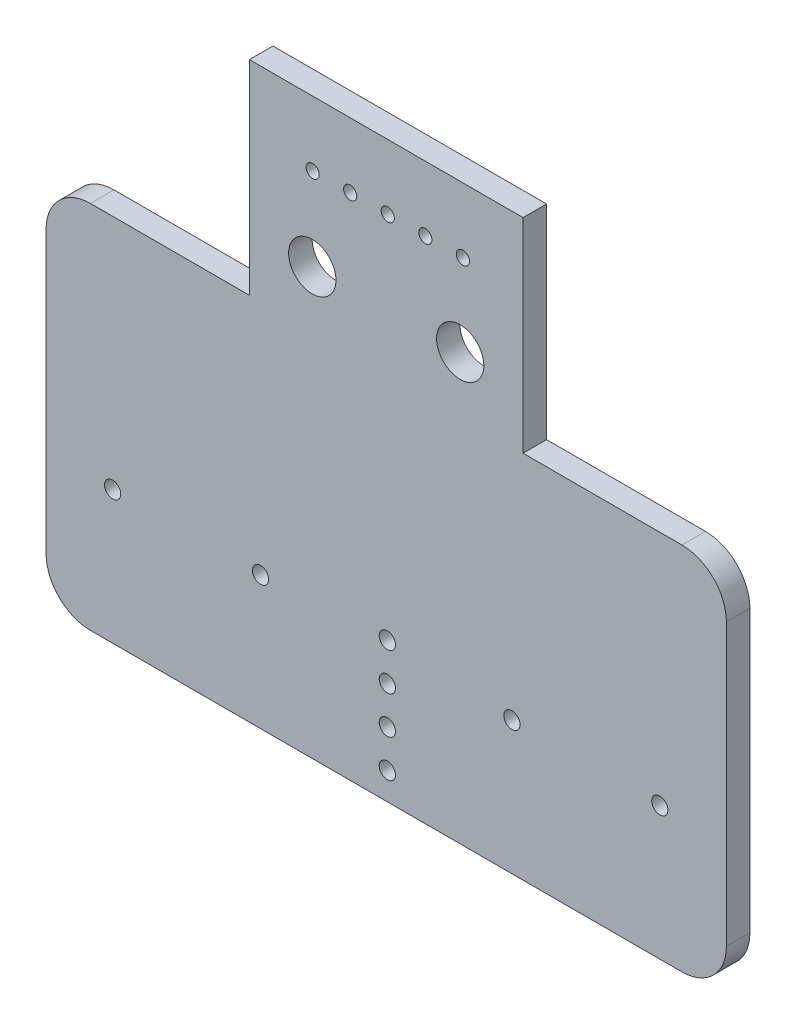
ISO-10303-21;
HEADER;
FILE_DESCRIPTION(('STEP AP214'),'2;1');
FILE_NAME('part.step','',(''),(''),'','','');
FILE_SCHEMA(('AUTOMOTIVE_DESIGN { 1 0 10303 214 1 1 1 1 }'));
ENDSEC;
DATA;
#1=APPLICATION_CONTEXT('core data for automotive mechanical design processes');
#2=APPLICATION_PROTOCOL_DEFINITION('international standard','automotive_design',2000,#1);
#3=PRODUCT_CONTEXT('',#1,'mechanical');
#4=PRODUCT('Part','Part','',(#3));
#5=PRODUCT_RELATED_PRODUCT_CATEGORY('part','',(#4));
#6=PRODUCT_DEFINITION_FORMATION('','',#4);
#7=PRODUCT_DEFINITION_CONTEXT('part definition',#1,'design');
#8=PRODUCT_DEFINITION('design','',#6,#7);
#9=PRODUCT_DEFINITION_SHAPE('','',#8);
#10=(LENGTH_UNIT() NAMED_UNIT(*) SI_UNIT(.MILLI.,.METRE.));
#11=(NAMED_UNIT(*) PLANE_ANGLE_UNIT() SI_UNIT($,.RADIAN.));
#12=(NAMED_UNIT(*) SI_UNIT($,.STERADIAN.) SOLID_ANGLE_UNIT());
#13=UNCERTAINTY_MEASURE_WITH_UNIT(LENGTH_MEASURE(1.E-05),#10,'distance_accuracy_value','');
#14=(GEOMETRIC_REPRESENTATION_CONTEXT(3) GLOBAL_UNCERTAINTY_ASSIGNED_CONTEXT((#13)) GLOBAL_UNIT_ASSIGNED_CONTEXT((#10,
#11,#12)) REPRESENTATION_CONTEXT('',''));
#15=CARTESIAN_POINT('',(0.,0.,0.));
#16=DIRECTION('',(0.,0.,1.));
#17=DIRECTION('',(1.,0.,0.));
#18=AXIS2_PLACEMENT_3D('',#15,#16,#17);
#19=CARTESIAN_POINT('',(88.90599822998,72.36499786377,1.59143954));
#20=DIRECTION('',(0.,0.,1.));
#21=DIRECTION('',(1.,0.,0.));
#22=AXIS2_PLACEMENT_3D('',#19,#20,#21);
#23=PLANE('',#22);
#24=CARTESIAN_POINT('',(117.0899995,103.78000072,1.59143954));
#25=DIRECTION('',(0.,0.,1.));
#26=DIRECTION('',(1.,0.,0.));
#27=AXIS2_PLACEMENT_3D('',#24,#25,#26);
#28=CIRCLE('',#27,0.4445);
#29=CARTESIAN_POINT('',(117.5344995,103.78000072,1.59143954));
#30=VERTEX_POINT('',#29);
#31=EDGE_CURVE('E27',#30,#30,#28,.T.);
#32=ORIENTED_EDGE('',*,*,#31,.F.);
#33=EDGE_LOOP('',(#32));
#34=FACE_BOUND('',#33,.T.);
#35=CARTESIAN_POINT('',(116.90599936,98.16500052,1.59143954));
#36=DIRECTION('',(0.,0.,1.));
#37=DIRECTION('',(1.,0.,0.));
#38=AXIS2_PLACEMENT_3D('',#35,#36,#37);
#39=CIRCLE('',#38,1.59999934);
#40=CARTESIAN_POINT('',(118.5059987,98.16500052,1.59143954));
#41=VERTEX_POINT('',#40);
#42=EDGE_CURVE('E310',#41,#41,#39,.T.);
#43=ORIENTED_EDGE('',*,*,#42,.F.);
#44=EDGE_LOOP('',(#43));
#45=FACE_BOUND('',#44,.T.);
#46=CARTESIAN_POINT('',(112.0099995,103.78000072,1.59143954));
#47=DIRECTION('',(0.,0.,1.));
#48=DIRECTION('',(1.,0.,0.));
#49=AXIS2_PLACEMENT_3D('',#46,#47,#48);
#50=CIRCLE('',#49,0.4445);
#51=CARTESIAN_POINT('',(112.4544995,103.78000072,1.59143954));
#52=VERTEX_POINT('',#51);
#53=EDGE_CURVE('E383',#52,#52,#50,.T.);
#54=ORIENTED_EDGE('',*,*,#53,.F.);
#55=EDGE_LOOP('',(#54));
#56=FACE_BOUND('',#55,.T.);
#57=CARTESIAN_POINT('',(114.5499995,103.78000072,1.59143954));
#58=DIRECTION('',(0.,0.,1.));
#59=DIRECTION('',(1.,0.,0.));
#60=AXIS2_PLACEMENT_3D('',#57,#58,#59);
#61=CIRCLE('',#60,0.4445);
#62=CARTESIAN_POINT('',(114.9944995,103.78000072,1.59143954));
#63=VERTEX_POINT('',#62);
#64=EDGE_CURVE('E333',#63,#63,#61,.T.);
#65=ORIENTED_EDGE('',*,*,#64,.F.);
#66=EDGE_LOOP('',(#65));
#67=FACE_BOUND('',#66,.T.);
#68=CARTESIAN_POINT('',(120.40599998,78.36499948,1.59143954));
#69=DIRECTION('',(0.,0.,1.));
#70=DIRECTION('',(1.,0.,0.));
#71=AXIS2_PLACEMENT_3D('',#68,#69,#70);
#72=CIRCLE('',#71,0.5499989);
#73=CARTESIAN_POINT('',(120.95599888,78.36499948,1.59143954));
#74=VERTEX_POINT('',#73);
#75=EDGE_CURVE('E277',#74,#74,#72,.T.);
#76=ORIENTED_EDGE('',*,*,#75,.F.);
#77=EDGE_LOOP('',(#76));
#78=FACE_BOUND('',#77,.T.);
#79=CARTESIAN_POINT('',(130.4060003,78.36499948,1.59143954));
#80=DIRECTION('',(0.,0.,1.));
#81=DIRECTION('',(1.,0.,0.));
#82=AXIS2_PLACEMENT_3D('',#79,#80,#81);
#83=CIRCLE('',#82,0.5499989);
#84=CARTESIAN_POINT('',(130.9559992,78.36499948,1.59143954));
#85=VERTEX_POINT('',#84);
#86=EDGE_CURVE('E287',#85,#85,#83,.T.);
#87=ORIENTED_EDGE('',*,*,#86,.F.);
#88=EDGE_LOOP('',(#87));
#89=FACE_BOUND('',#88,.T.);
#90=CARTESIAN_POINT('',(111.97999956,78.82999982,1.59143954));
#91=DIRECTION('',(0.,0.,1.));
#92=DIRECTION('',(1.,0.,0.));
#93=AXIS2_PLACEMENT_3D('',#90,#91,#92);
#94=CIRCLE('',#93,0.5499989);
#95=CARTESIAN_POINT('',(112.52999846,78.82999982,1.59143954));
#96=VERTEX_POINT('',#95);
#97=EDGE_CURVE('E507',#96,#96,#94,.T.);
#98=ORIENTED_EDGE('',*,*,#97,.F.);
#99=EDGE_LOOP('',(#98));
#100=FACE_BOUND('',#99,.T.);
#101=CARTESIAN_POINT('',(111.97999956,73.74999982,1.59143954));
#102=DIRECTION('',(0.,0.,1.));
#103=DIRECTION('',(1.,0.,0.));
#104=AXIS2_PLACEMENT_3D('',#101,#102,#103);
#105=CIRCLE('',#104,0.5499989);
#106=CARTESIAN_POINT('',(112.52999846,73.74999982,1.59143954));
#107=VERTEX_POINT('',#106);
#108=EDGE_CURVE('E454',#107,#107,#105,.T.);
#109=ORIENTED_EDGE('',*,*,#108,.F.);
#110=EDGE_LOOP('',(#109));
#111=FACE_BOUND('',#110,.T.);
#112=CARTESIAN_POINT('',(109.4699995,103.78000072,1.59143954));
#113=DIRECTION('',(0.,0.,1.));
#114=DIRECTION('',(1.,0.,0.));
#115=AXIS2_PLACEMENT_3D('',#112,#113,#114);
#116=CIRCLE('',#115,0.4445);
#117=CARTESIAN_POINT('',(109.9144995,103.78000072,1.59143954));
#118=VERTEX_POINT('',#117);
#119=EDGE_CURVE('E436',#118,#118,#116,.T.);
#120=ORIENTED_EDGE('',*,*,#119,.F.);
#121=EDGE_LOOP('',(#120));
#122=FACE_BOUND('',#121,.T.);
#123=CARTESIAN_POINT('',(106.90599904,98.16500052,1.59143954));
#124=DIRECTION('',(0.,0.,1.));
#125=DIRECTION('',(1.,0.,0.));
#126=AXIS2_PLACEMENT_3D('',#123,#124,#125);
#127=CIRCLE('',#126,1.59999934);
#128=CARTESIAN_POINT('',(108.50599838,98.16500052,1.59143954));
#129=VERTEX_POINT('',#128);
#130=EDGE_CURVE('E432',#129,#129,#127,.T.);
#131=ORIENTED_EDGE('',*,*,#130,.F.);
#132=EDGE_LOOP('',(#131));
#133=FACE_BOUND('',#132,.T.);
#134=CARTESIAN_POINT('',(106.9299995,103.78000072,1.59143954));
#135=DIRECTION('',(0.,0.,1.));
#136=DIRECTION('',(1.,0.,0.));
#137=AXIS2_PLACEMENT_3D('',#134,#135,#136);
#138=CIRCLE('',#137,0.4445);
#139=CARTESIAN_POINT('',(107.3744995,103.78000072,1.59143954));
#140=VERTEX_POINT('',#139);
#141=EDGE_CURVE('E282',#140,#140,#138,.T.);
#142=ORIENTED_EDGE('',*,*,#141,.F.);
#143=EDGE_LOOP('',(#142));
#144=FACE_BOUND('',#143,.T.);
#145=CARTESIAN_POINT('',(93.40600064,78.36499948,1.59143954));
#146=DIRECTION('',(0.,0.,1.));
#147=DIRECTION('',(1.,0.,0.));
#148=AXIS2_PLACEMENT_3D('',#145,#146,#147);
#149=CIRCLE('',#148,0.5499989);
#150=CARTESIAN_POINT('',(93.95599954,78.36499948,1.59143954));
#151=VERTEX_POINT('',#150);
#152=EDGE_CURVE('E222',#151,#151,#149,.T.);
#153=ORIENTED_EDGE('',*,*,#152,.F.);
#154=EDGE_LOOP('',(#153));
#155=FACE_BOUND('',#154,.T.);
#156=CARTESIAN_POINT('',(111.97999956,76.28999982,1.59143954));
#157=DIRECTION('',(0.,0.,1.));
#158=DIRECTION('',(1.,0.,0.));
#159=AXIS2_PLACEMENT_3D('',#156,#157,#158);
#160=CIRCLE('',#159,0.5499989);
#161=CARTESIAN_POINT('',(112.52999846,76.28999982,1.59143954));
#162=VERTEX_POINT('',#161);
#163=EDGE_CURVE('E407',#162,#162,#160,.T.);
#164=ORIENTED_EDGE('',*,*,#163,.F.);
#165=EDGE_LOOP('',(#164));
#166=FACE_BOUND('',#165,.T.);
#167=CARTESIAN_POINT('',(111.97999956,71.20999982,1.59143954));
#168=DIRECTION('',(0.,0.,1.));
#169=DIRECTION('',(1.,0.,0.));
#170=AXIS2_PLACEMENT_3D('',#167,#168,#169);
#171=CIRCLE('',#170,0.5499989);
#172=CARTESIAN_POINT('',(112.52999846,71.20999982,1.59143954));
#173=VERTEX_POINT('',#172);
#174=EDGE_CURVE('E272',#173,#173,#171,.T.);
#175=ORIENTED_EDGE('',*,*,#174,.F.);
#176=EDGE_LOOP('',(#175));
#177=FACE_BOUND('',#176,.T.);
#178=CARTESIAN_POINT('',(103.40600096,78.36499948,1.59143954));
#179=DIRECTION('',(0.,0.,1.));
#180=DIRECTION('',(1.,0.,0.));
#181=AXIS2_PLACEMENT_3D('',#178,#179,#180);
#182=CIRCLE('',#181,0.5499989);
#183=CARTESIAN_POINT('',(103.95599986,78.36499948,1.59143954));
#184=VERTEX_POINT('',#183);
#185=EDGE_CURVE('E374',#184,#184,#182,.T.);
#186=ORIENTED_EDGE('',*,*,#185,.F.);
#187=EDGE_LOOP('',(#186));
#188=FACE_BOUND('',#187,.T.);
#189=CARTESIAN_POINT('',(91.907110995802,72.366110629591,1.59143954));
#190=DIRECTION('',(0.,0.,-1.));
#191=DIRECTION('',(-0.000370784383045174,-0.999999931259468,0.));
#192=AXIS2_PLACEMENT_3D('',#189,#190,#191);
#193=CIRCLE('',#192,3.00111297212);
#194=CARTESIAN_POINT('',(91.90599822998,69.36499786377,1.59143954));
#195=VERTEX_POINT('',#194);
#196=CARTESIAN_POINT('',(88.90599822998,72.36499786377,1.59143954));
#197=VERTEX_POINT('',#196);
#198=EDGE_CURVE('E235',#195,#197,#193,.T.);
#199=ORIENTED_EDGE('',*,*,#198,.F.);
#200=DIRECTION('',(-1.,0.,0.));
#201=VECTOR('',#200,1.);
#202=CARTESIAN_POINT('',(131.90600585937,69.36499786377,1.59143954));
#203=LINE('',#202,#201);
#204=CARTESIAN_POINT('',(131.90600585937,69.36499786377,1.59143954));
#205=VERTEX_POINT('',#204);
#206=EDGE_CURVE('E238',#205,#195,#203,.T.);
#207=ORIENTED_EDGE('',*,*,#206,.F.);
#208=CARTESIAN_POINT('',(131.90488005763,72.366123665506,1.59143954));
#209=DIRECTION('',(0.,0.,-1.));
#210=DIRECTION('',(0.999999929640072,-0.000375126446434927,0.));
#211=AXIS2_PLACEMENT_3D('',#208,#209,#210);
#212=CIRCLE('',#211,3.001126012896);
#213=CARTESIAN_POINT('',(134.90600585937,72.36499786377,1.59143954));
#214=VERTEX_POINT('',#213);
#215=EDGE_CURVE('E295',#214,#205,#212,.T.);
#216=ORIENTED_EDGE('',*,*,#215,.F.);
#217=DIRECTION('',(0.,-1.,0.));
#218=VECTOR('',#217,1.);
#219=CARTESIAN_POINT('',(134.90600585937,91.36499786377,1.59143954));
#220=LINE('',#219,#218);
#221=CARTESIAN_POINT('',(134.90600585937,91.36499786377,1.59143954));
#222=VERTEX_POINT('',#221);
#223=EDGE_CURVE('E368',#222,#214,#220,.T.);
#224=ORIENTED_EDGE('',*,*,#223,.F.);
#225=CARTESIAN_POINT('',(131.90659982584,91.36559183024,1.59143954));
#226=DIRECTION('',(0.,0.,-1.));
#227=DIRECTION('',(-0.000198028026988589,0.99999998039245,0.));
#228=AXIS2_PLACEMENT_3D('',#225,#226,#227);
#229=CIRCLE('',#228,2.99940609234);
#230=CARTESIAN_POINT('',(131.90600585937,94.36499786377,1.59143954));
#231=VERTEX_POINT('',#230);
#232=EDGE_CURVE('E424',#231,#222,#229,.T.);
#233=ORIENTED_EDGE('',*,*,#232,.F.);
#234=DIRECTION('',(1.,0.,0.));
#235=VECTOR('',#234,1.);
#236=CARTESIAN_POINT('',(121.15599822998,94.36499786377,1.59143954));
#237=LINE('',#236,#235);
#238=CARTESIAN_POINT('',(121.15599822998,94.36499786377,1.59143954));
#239=VERTEX_POINT('',#238);
#240=EDGE_CURVE('E480',#239,#231,#237,.T.);
#241=ORIENTED_EDGE('',*,*,#240,.F.);
#242=DIRECTION('',(0.,-1.,0.));
#243=VECTOR('',#242,1.);
#244=CARTESIAN_POINT('',(121.15599822998,108.16500091552,1.59143954));
#245=LINE('',#244,#243);
#246=CARTESIAN_POINT('',(121.15599822998,108.16500091552,1.59143954));
#247=VERTEX_POINT('',#246);
#248=EDGE_CURVE('E361',#247,#239,#245,.T.);
#249=ORIENTED_EDGE('',*,*,#248,.F.);
#250=DIRECTION('',(1.,0.,0.));
#251=VECTOR('',#250,1.);
#252=CARTESIAN_POINT('',(102.65599822998,108.16500091552,1.59143954));
#253=LINE('',#252,#251);
#254=CARTESIAN_POINT('',(102.65599822998,108.16500091552,1.59143954));
#255=VERTEX_POINT('',#254);
#256=EDGE_CURVE('E298',#255,#247,#253,.T.);
#257=ORIENTED_EDGE('',*,*,#256,.F.);
#258=DIRECTION('',(0.,1.,0.));
#259=VECTOR('',#258,1.);
#260=CARTESIAN_POINT('',(102.65599822998,94.36499786377,1.59143954));
#261=LINE('',#260,#259);
#262=CARTESIAN_POINT('',(102.65599822998,94.36499786377,1.59143954));
#263=VERTEX_POINT('',#262);
#264=EDGE_CURVE('E345',#263,#255,#261,.T.);
#265=ORIENTED_EDGE('',*,*,#264,.F.);
#266=DIRECTION('',(1.,0.,0.));
#267=VECTOR('',#266,1.);
#268=CARTESIAN_POINT('',(91.90599822998,94.36499786377,1.59143954));
#269=LINE('',#268,#267);
#270=CARTESIAN_POINT('',(91.90599822998,94.36499786377,1.59143954));
#271=VERTEX_POINT('',#270);
#272=EDGE_CURVE('E394',#271,#263,#269,.T.);
#273=ORIENTED_EDGE('',*,*,#272,.F.);
#274=CARTESIAN_POINT('',(91.907097960001,91.363898133749,1.59143954));
#275=DIRECTION('',(0.,0.,-1.));
#276=DIRECTION('',(-0.999999932860011,0.000366442319648004,0.));
#277=AXIS2_PLACEMENT_3D('',#274,#275,#276);
#278=CIRCLE('',#277,3.001099931514);
#279=CARTESIAN_POINT('',(88.90599822998,91.36499786377,1.59143954));
#280=VERTEX_POINT('',#279);
#281=EDGE_CURVE('E367',#280,#271,#278,.T.);
#282=ORIENTED_EDGE('',*,*,#281,.F.);
#283=DIRECTION('',(0.,1.,0.));
#284=VECTOR('',#283,1.);
#285=CARTESIAN_POINT('',(88.90599822998,72.36499786377,1.59143954));
#286=LINE('',#285,#284);
#287=EDGE_CURVE('E241',#197,#280,#286,.T.);
#288=ORIENTED_EDGE('',*,*,#287,.F.);
#289=EDGE_LOOP('',(#199,#207,#216,#224,#233,#241,#249,#257,#265,#273,#282,#288));
#290=FACE_BOUND('',#289,.T.);
#291=ADVANCED_FACE('F16',(#34,#45,#56,#67,#78,#89,#100,#111,#122,#133,#144,#155,#166,#177,#188,
#290),#23,.T.);
#292=CARTESIAN_POINT('',(88.90599822998,72.36499786377,0.));
#293=DIRECTION('',(0.,0.,1.));
#294=DIRECTION('',(1.,0.,0.));
#295=AXIS2_PLACEMENT_3D('',#292,#293,#294);
#296=PLANE('',#295);
#297=CARTESIAN_POINT('',(117.0899995,103.78000072,0.));
#298=DIRECTION('',(0.,0.,1.));
#299=DIRECTION('',(1.,0.,0.));
#300=AXIS2_PLACEMENT_3D('',#297,#298,#299);
#301=CIRCLE('',#300,0.4445);
#302=CARTESIAN_POINT('',(117.5344995,103.78000072,0.));
#303=VERTEX_POINT('',#302);
#304=EDGE_CURVE('E11',#303,#303,#301,.T.);
#305=ORIENTED_EDGE('',*,*,#304,.T.);
#306=EDGE_LOOP('',(#305));
#307=FACE_BOUND('',#306,.T.);
#308=CARTESIAN_POINT('',(116.90599936,98.16500052,0.));
#309=DIRECTION('',(0.,0.,1.));
#310=DIRECTION('',(1.,0.,0.));
#311=AXIS2_PLACEMENT_3D('',#308,#309,#310);
#312=CIRCLE('',#311,1.59999934);
#313=CARTESIAN_POINT('',(118.5059987,98.16500052,0.));
#314=VERTEX_POINT('',#313);
#315=EDGE_CURVE('E306',#314,#314,#312,.T.);
#316=ORIENTED_EDGE('',*,*,#315,.T.);
#317=EDGE_LOOP('',(#316));
#318=FACE_BOUND('',#317,.T.);
#319=CARTESIAN_POINT('',(112.0099995,103.78000072,0.));
#320=DIRECTION('',(0.,0.,1.));
#321=DIRECTION('',(1.,0.,0.));
#322=AXIS2_PLACEMENT_3D('',#319,#320,#321);
#323=CIRCLE('',#322,0.4445);
#324=CARTESIAN_POINT('',(112.4544995,103.78000072,0.));
#325=VERTEX_POINT('',#324);
#326=EDGE_CURVE('E327',#325,#325,#323,.T.);
#327=ORIENTED_EDGE('',*,*,#326,.T.);
#328=EDGE_LOOP('',(#327));
#329=FACE_BOUND('',#328,.T.);
#330=CARTESIAN_POINT('',(114.5499995,103.78000072,0.));
#331=DIRECTION('',(0.,0.,1.));
#332=DIRECTION('',(1.,0.,0.));
#333=AXIS2_PLACEMENT_3D('',#330,#331,#332);
#334=CIRCLE('',#333,0.4445);
#335=CARTESIAN_POINT('',(114.9944995,103.78000072,0.));
#336=VERTEX_POINT('',#335);
#337=EDGE_CURVE('E337',#336,#336,#334,.T.);
#338=ORIENTED_EDGE('',*,*,#337,.T.);
#339=EDGE_LOOP('',(#338));
#340=FACE_BOUND('',#339,.T.);
#341=CARTESIAN_POINT('',(120.40599998,78.36499948,0.));
#342=DIRECTION('',(0.,0.,1.));
#343=DIRECTION('',(1.,0.,0.));
#344=AXIS2_PLACEMENT_3D('',#341,#342,#343);
#345=CIRCLE('',#344,0.5499989);
#346=CARTESIAN_POINT('',(120.95599888,78.36499948,0.));
#347=VERTEX_POINT('',#346);
#348=EDGE_CURVE('E280',#347,#347,#345,.T.);
#349=ORIENTED_EDGE('',*,*,#348,.T.);
#350=EDGE_LOOP('',(#349));
#351=FACE_BOUND('',#350,.T.);
#352=CARTESIAN_POINT('',(130.4060003,78.36499948,0.));
#353=DIRECTION('',(0.,0.,1.));
#354=DIRECTION('',(1.,0.,0.));
#355=AXIS2_PLACEMENT_3D('',#352,#353,#354);
#356=CIRCLE('',#355,0.5499989);
#357=CARTESIAN_POINT('',(130.9559992,78.36499948,0.));
#358=VERTEX_POINT('',#357);
#359=EDGE_CURVE('E289',#358,#358,#356,.T.);
#360=ORIENTED_EDGE('',*,*,#359,.T.);
#361=EDGE_LOOP('',(#360));
#362=FACE_BOUND('',#361,.T.);
#363=CARTESIAN_POINT('',(111.97999956,78.82999982,0.));
#364=DIRECTION('',(0.,0.,1.));
#365=DIRECTION('',(1.,0.,0.));
#366=AXIS2_PLACEMENT_3D('',#363,#364,#365);
#367=CIRCLE('',#366,0.5499989);
#368=CARTESIAN_POINT('',(112.52999846,78.82999982,0.));
#369=VERTEX_POINT('',#368);
#370=EDGE_CURVE('E398',#369,#369,#367,.T.);
#371=ORIENTED_EDGE('',*,*,#370,.T.);
#372=EDGE_LOOP('',(#371));
#373=FACE_BOUND('',#372,.T.);
#374=CARTESIAN_POINT('',(111.97999956,73.74999982,0.));
#375=DIRECTION('',(0.,0.,1.));
#376=DIRECTION('',(1.,0.,0.));
#377=AXIS2_PLACEMENT_3D('',#374,#375,#376);
#378=CIRCLE('',#377,0.5499989);
#379=CARTESIAN_POINT('',(112.52999846,73.74999982,0.));
#380=VERTEX_POINT('',#379);
#381=EDGE_CURVE('E466',#380,#380,#378,.T.);
#382=ORIENTED_EDGE('',*,*,#381,.T.);
#383=EDGE_LOOP('',(#382));
#384=FACE_BOUND('',#383,.T.);
#385=CARTESIAN_POINT('',(109.4699995,103.78000072,0.));
#386=DIRECTION('',(0.,0.,1.));
#387=DIRECTION('',(1.,0.,0.));
#388=AXIS2_PLACEMENT_3D('',#385,#386,#387);
#389=CIRCLE('',#388,0.4445);
#390=CARTESIAN_POINT('',(109.9144995,103.78000072,0.));
#391=VERTEX_POINT('',#390);
#392=EDGE_CURVE('E439',#391,#391,#389,.T.);
#393=ORIENTED_EDGE('',*,*,#392,.T.);
#394=EDGE_LOOP('',(#393));
#395=FACE_BOUND('',#394,.T.);
#396=CARTESIAN_POINT('',(106.90599904,98.16500052,0.));
#397=DIRECTION('',(0.,0.,1.));
#398=DIRECTION('',(1.,0.,0.));
#399=AXIS2_PLACEMENT_3D('',#396,#397,#398);
#400=CIRCLE('',#399,1.59999934);
#401=CARTESIAN_POINT('',(108.50599838,98.16500052,0.));
#402=VERTEX_POINT('',#401);
#403=EDGE_CURVE('E435',#402,#402,#400,.T.);
#404=ORIENTED_EDGE('',*,*,#403,.T.);
#405=EDGE_LOOP('',(#404));
#406=FACE_BOUND('',#405,.T.);
#407=CARTESIAN_POINT('',(106.9299995,103.78000072,0.));
#408=DIRECTION('',(0.,0.,1.));
#409=DIRECTION('',(1.,0.,0.));
#410=AXIS2_PLACEMENT_3D('',#407,#408,#409);
#411=CIRCLE('',#410,0.4445);
#412=CARTESIAN_POINT('',(107.3744995,103.78000072,0.));
#413=VERTEX_POINT('',#412);
#414=EDGE_CURVE('E284',#413,#413,#411,.T.);
#415=ORIENTED_EDGE('',*,*,#414,.T.);
#416=EDGE_LOOP('',(#415));
#417=FACE_BOUND('',#416,.T.);
#418=CARTESIAN_POINT('',(93.40600064,78.36499948,0.));
#419=DIRECTION('',(0.,0.,1.));
#420=DIRECTION('',(1.,0.,0.));
#421=AXIS2_PLACEMENT_3D('',#418,#419,#420);
#422=CIRCLE('',#421,0.5499989);
#423=CARTESIAN_POINT('',(93.95599954,78.36499948,0.));
#424=VERTEX_POINT('',#423);
#425=EDGE_CURVE('E211',#424,#424,#422,.T.);
#426=ORIENTED_EDGE('',*,*,#425,.T.);
#427=EDGE_LOOP('',(#426));
#428=FACE_BOUND('',#427,.T.);
#429=CARTESIAN_POINT('',(111.97999956,76.28999982,0.));
#430=DIRECTION('',(0.,0.,1.));
#431=DIRECTION('',(1.,0.,0.));
#432=AXIS2_PLACEMENT_3D('',#429,#430,#431);
#433=CIRCLE('',#432,0.5499989);
#434=CARTESIAN_POINT('',(112.52999846,76.28999982,0.));
#435=VERTEX_POINT('',#434);
#436=EDGE_CURVE('E404',#435,#435,#433,.T.);
#437=ORIENTED_EDGE('',*,*,#436,.T.);
#438=EDGE_LOOP('',(#437));
#439=FACE_BOUND('',#438,.T.);
#440=CARTESIAN_POINT('',(111.97999956,71.20999982,0.));
#441=DIRECTION('',(0.,0.,1.));
#442=DIRECTION('',(1.,0.,0.));
#443=AXIS2_PLACEMENT_3D('',#440,#441,#442);
#444=CIRCLE('',#443,0.5499989);
#445=CARTESIAN_POINT('',(112.52999846,71.20999982,0.));
#446=VERTEX_POINT('',#445);
#447=EDGE_CURVE('E275',#446,#446,#444,.T.);
#448=ORIENTED_EDGE('',*,*,#447,.T.);
#449=EDGE_LOOP('',(#448));
#450=FACE_BOUND('',#449,.T.);
#451=CARTESIAN_POINT('',(103.40600096,78.36499948,0.));
#452=DIRECTION('',(0.,0.,1.));
#453=DIRECTION('',(1.,0.,0.));
#454=AXIS2_PLACEMENT_3D('',#451,#452,#453);
#455=CIRCLE('',#454,0.5499989);
#456=CARTESIAN_POINT('',(103.95599986,78.36499948,0.));
#457=VERTEX_POINT('',#456);
#458=EDGE_CURVE('E377',#457,#457,#455,.T.);
#459=ORIENTED_EDGE('',*,*,#458,.T.);
#460=EDGE_LOOP('',(#459));
#461=FACE_BOUND('',#460,.T.);
#462=DIRECTION('',(0.,1.,0.));
#463=VECTOR('',#462,1.);
#464=CARTESIAN_POINT('',(88.90599822998,72.36499786377,0.));
#465=LINE('',#464,#463);
#466=CARTESIAN_POINT('',(88.90599822998,72.36499786377,0.));
#467=VERTEX_POINT('',#466);
#468=CARTESIAN_POINT('',(88.90599822998,91.36499786377,0.));
#469=VERTEX_POINT('',#468);
#470=EDGE_CURVE('E390',#467,#469,#465,.T.);
#471=ORIENTED_EDGE('',*,*,#470,.T.);
#472=CARTESIAN_POINT('',(91.907097960001,91.363898133749,0.));
#473=DIRECTION('',(0.,0.,-1.));
#474=DIRECTION('',(-0.999999932860011,0.000366442319648004,0.));
#475=AXIS2_PLACEMENT_3D('',#472,#473,#474);
#476=CIRCLE('',#475,3.001099931514);
#477=CARTESIAN_POINT('',(91.90599822998,94.36499786377,0.));
#478=VERTEX_POINT('',#477);
#479=EDGE_CURVE('E366',#469,#478,#476,.T.);
#480=ORIENTED_EDGE('',*,*,#479,.T.);
#481=DIRECTION('',(1.,0.,0.));
#482=VECTOR('',#481,1.);
#483=CARTESIAN_POINT('',(91.90599822998,94.36499786377,0.));
#484=LINE('',#483,#482);
#485=CARTESIAN_POINT('',(102.65599822998,94.36499786377,0.));
#486=VERTEX_POINT('',#485);
#487=EDGE_CURVE('E341',#478,#486,#484,.T.);
#488=ORIENTED_EDGE('',*,*,#487,.T.);
#489=DIRECTION('',(0.,1.,0.));
#490=VECTOR('',#489,1.);
#491=CARTESIAN_POINT('',(102.65599822998,94.36499786377,0.));
#492=LINE('',#491,#490);
#493=CARTESIAN_POINT('',(102.65599822998,108.16500091552,0.));
#494=VERTEX_POINT('',#493);
#495=EDGE_CURVE('E303',#486,#494,#492,.T.);
#496=ORIENTED_EDGE('',*,*,#495,.T.);
#497=DIRECTION('',(1.,0.,0.));
#498=VECTOR('',#497,1.);
#499=CARTESIAN_POINT('',(102.65599822998,108.16500091552,0.));
#500=LINE('',#499,#498);
#501=CARTESIAN_POINT('',(121.15599822998,108.16500091552,0.));
#502=VERTEX_POINT('',#501);
#503=EDGE_CURVE('E357',#494,#502,#500,.T.);
#504=ORIENTED_EDGE('',*,*,#503,.T.);
#505=DIRECTION('',(0.,-1.,0.));
#506=VECTOR('',#505,1.);
#507=CARTESIAN_POINT('',(121.15599822998,108.16500091552,0.));
#508=LINE('',#507,#506);
#509=CARTESIAN_POINT('',(121.15599822998,94.36499786377,0.));
#510=VERTEX_POINT('',#509);
#511=EDGE_CURVE('E481',#502,#510,#508,.T.);
#512=ORIENTED_EDGE('',*,*,#511,.T.);
#513=DIRECTION('',(1.,0.,0.));
#514=VECTOR('',#513,1.);
#515=CARTESIAN_POINT('',(121.15599822998,94.36499786377,0.));
#516=LINE('',#515,#514);
#517=CARTESIAN_POINT('',(131.90600585937,94.36499786377,0.));
#518=VERTEX_POINT('',#517);
#519=EDGE_CURVE('E420',#510,#518,#516,.T.);
#520=ORIENTED_EDGE('',*,*,#519,.T.);
#521=CARTESIAN_POINT('',(131.90659982584,91.36559183024,0.));
#522=DIRECTION('',(0.,0.,-1.));
#523=DIRECTION('',(-0.000198028026988589,0.99999998039245,0.));
#524=AXIS2_PLACEMENT_3D('',#521,#522,#523);
#525=CIRCLE('',#524,2.99940609234);
#526=CARTESIAN_POINT('',(134.90600585937,91.36499786377,0.));
#527=VERTEX_POINT('',#526);
#528=EDGE_CURVE('E373',#518,#527,#525,.T.);
#529=ORIENTED_EDGE('',*,*,#528,.T.);
#530=DIRECTION('',(0.,-1.,0.));
#531=VECTOR('',#530,1.);
#532=CARTESIAN_POINT('',(134.90600585937,91.36499786377,0.));
#533=LINE('',#532,#531);
#534=CARTESIAN_POINT('',(134.90600585937,72.36499786377,0.));
#535=VERTEX_POINT('',#534);
#536=EDGE_CURVE('E20',#527,#535,#533,.T.);
#537=ORIENTED_EDGE('',*,*,#536,.T.);
#538=CARTESIAN_POINT('',(131.90488005763,72.366123665506,0.));
#539=DIRECTION('',(0.,0.,-1.));
#540=DIRECTION('',(0.999999929640072,-0.000375126446434927,0.));
#541=AXIS2_PLACEMENT_3D('',#538,#539,#540);
#542=CIRCLE('',#541,3.001126012896);
#543=CARTESIAN_POINT('',(131.90600585937,69.36499786377,0.));
#544=VERTEX_POINT('',#543);
#545=EDGE_CURVE('E261',#535,#544,#542,.T.);
#546=ORIENTED_EDGE('',*,*,#545,.T.);
#547=DIRECTION('',(-1.,0.,0.));
#548=VECTOR('',#547,1.);
#549=CARTESIAN_POINT('',(131.90600585937,69.36499786377,0.));
#550=LINE('',#549,#548);
#551=CARTESIAN_POINT('',(91.90599822998,69.36499786377,0.));
#552=VERTEX_POINT('',#551);
#553=EDGE_CURVE('E247',#544,#552,#550,.T.);
#554=ORIENTED_EDGE('',*,*,#553,.T.);
#555=CARTESIAN_POINT('',(91.907110995802,72.366110629591,0.));
#556=DIRECTION('',(0.,0.,-1.));
#557=DIRECTION('',(-0.000370784383045174,-0.999999931259468,0.));
#558=AXIS2_PLACEMENT_3D('',#555,#556,#557);
#559=CIRCLE('',#558,3.00111297212);
#560=EDGE_CURVE('E246',#552,#467,#559,.T.);
#561=ORIENTED_EDGE('',*,*,#560,.T.);
#562=EDGE_LOOP('',(#471,#480,#488,#496,#504,#512,#520,#529,#537,#546,#554,#561));
#563=FACE_BOUND('',#562,.T.);
#564=ADVANCED_FACE('F571',(#307,#318,#329,#340,#351,#362,#373,#384,#395,#406,#417,#428,#439,
#450,#461,#563),#296,.F.);
#565=CARTESIAN_POINT('',(117.0899995,103.78000072,0.));
#566=DIRECTION('',(0.,0.,-1.));
#567=DIRECTION('',(1.,0.,0.));
#568=AXIS2_PLACEMENT_3D('',#565,#566,#567);
#569=CYLINDRICAL_SURFACE('',#568,0.4445);
#570=DIRECTION('',(0.,0.,1.));
#571=VECTOR('',#570,1.);
#572=CARTESIAN_POINT('',(117.5344995,103.78000072,0.));
#573=LINE('',#572,#571);
#574=EDGE_CURVE('E309',#303,#30,#573,.T.);
#575=ORIENTED_EDGE('',*,*,#574,.T.);
#576=ORIENTED_EDGE('',*,*,#31,.T.);
#577=ORIENTED_EDGE('',*,*,#574,.F.);
#578=ORIENTED_EDGE('',*,*,#304,.F.);
#579=EDGE_LOOP('',(#575,#576,#577,#578));
#580=FACE_BOUND('',#579,.T.);
#581=ADVANCED_FACE('F577',(#580),#569,.F.);
#582=CARTESIAN_POINT('',(116.90599936,98.16500052,0.));
#583=DIRECTION('',(0.,0.,-1.));
#584=DIRECTION('',(1.,0.,0.));
#585=AXIS2_PLACEMENT_3D('',#582,#583,#584);
#586=CYLINDRICAL_SURFACE('',#585,1.59999934);
#587=DIRECTION('',(0.,0.,1.));
#588=VECTOR('',#587,1.);
#589=CARTESIAN_POINT('',(118.5059987,98.16500052,0.));
#590=LINE('',#589,#588);
#591=EDGE_CURVE('E318',#314,#41,#590,.T.);
#592=ORIENTED_EDGE('',*,*,#591,.T.);
#593=ORIENTED_EDGE('',*,*,#42,.T.);
#594=ORIENTED_EDGE('',*,*,#591,.F.);
#595=ORIENTED_EDGE('',*,*,#315,.F.);
#596=EDGE_LOOP('',(#592,#593,#594,#595));
#597=FACE_BOUND('',#596,.T.);
#598=ADVANCED_FACE('F592',(#597),#586,.F.);
#599=CARTESIAN_POINT('',(112.0099995,103.78000072,0.));
#600=DIRECTION('',(0.,0.,-1.));
#601=DIRECTION('',(1.,0.,0.));
#602=AXIS2_PLACEMENT_3D('',#599,#600,#601);
#603=CYLINDRICAL_SURFACE('',#602,0.4445);
#604=DIRECTION('',(0.,0.,1.));
#605=VECTOR('',#604,1.);
#606=CARTESIAN_POINT('',(112.4544995,103.78000072,0.));
#607=LINE('',#606,#605);
#608=EDGE_CURVE('E379',#325,#52,#607,.T.);
#609=ORIENTED_EDGE('',*,*,#608,.T.);
#610=ORIENTED_EDGE('',*,*,#53,.T.);
#611=ORIENTED_EDGE('',*,*,#608,.F.);
#612=ORIENTED_EDGE('',*,*,#326,.F.);
#613=EDGE_LOOP('',(#609,#610,#611,#612));
#614=FACE_BOUND('',#613,.T.);
#615=ADVANCED_FACE('F589',(#614),#603,.F.);
#616=CARTESIAN_POINT('',(114.5499995,103.78000072,0.));
#617=DIRECTION('',(0.,0.,-1.));
#618=DIRECTION('',(1.,0.,0.));
#619=AXIS2_PLACEMENT_3D('',#616,#617,#618);
#620=CYLINDRICAL_SURFACE('',#619,0.4445);
#621=DIRECTION('',(0.,0.,1.));
#622=VECTOR('',#621,1.);
#623=CARTESIAN_POINT('',(114.9944995,103.78000072,0.));
#624=LINE('',#623,#622);
#625=EDGE_CURVE('E305',#336,#63,#624,.T.);
#626=ORIENTED_EDGE('',*,*,#625,.T.);
#627=ORIENTED_EDGE('',*,*,#64,.T.);
#628=ORIENTED_EDGE('',*,*,#625,.F.);
#629=ORIENTED_EDGE('',*,*,#337,.F.);
#630=EDGE_LOOP('',(#626,#627,#628,#629));
#631=FACE_BOUND('',#630,.T.);
#632=ADVANCED_FACE('F591',(#631),#620,.F.);
#633=CARTESIAN_POINT('',(120.40599998,78.36499948,0.));
#634=DIRECTION('',(0.,0.,-1.));
#635=DIRECTION('',(1.,0.,0.));
#636=AXIS2_PLACEMENT_3D('',#633,#634,#635);
#637=CYLINDRICAL_SURFACE('',#636,0.5499989);
#638=DIRECTION('',(0.,0.,1.));
#639=VECTOR('',#638,1.);
#640=CARTESIAN_POINT('',(120.95599888,78.36499948,0.));
#641=LINE('',#640,#639);
#642=EDGE_CURVE('E281',#347,#74,#641,.T.);
#643=ORIENTED_EDGE('',*,*,#642,.T.);
#644=ORIENTED_EDGE('',*,*,#75,.T.);
#645=ORIENTED_EDGE('',*,*,#642,.F.);
#646=ORIENTED_EDGE('',*,*,#348,.F.);
#647=EDGE_LOOP('',(#643,#644,#645,#646));
#648=FACE_BOUND('',#647,.T.);
#649=ADVANCED_FACE('F598',(#648),#637,.F.);
#650=CARTESIAN_POINT('',(130.4060003,78.36499948,0.));
#651=DIRECTION('',(0.,0.,-1.));
#652=DIRECTION('',(1.,0.,0.));
#653=AXIS2_PLACEMENT_3D('',#650,#651,#652);
#654=CYLINDRICAL_SURFACE('',#653,0.5499989);
#655=DIRECTION('',(0.,0.,1.));
#656=VECTOR('',#655,1.);
#657=CARTESIAN_POINT('',(130.9559992,78.36499948,0.));
#658=LINE('',#657,#656);
#659=EDGE_CURVE('E290',#358,#85,#658,.T.);
#660=ORIENTED_EDGE('',*,*,#659,.T.);
#661=ORIENTED_EDGE('',*,*,#86,.T.);
#662=ORIENTED_EDGE('',*,*,#659,.F.);
#663=ORIENTED_EDGE('',*,*,#359,.F.);
#664=EDGE_LOOP('',(#660,#661,#662,#663));
#665=FACE_BOUND('',#664,.T.);
#666=ADVANCED_FACE('F1131',(#665),#654,.F.);
#667=CARTESIAN_POINT('',(111.97999956,78.82999982,0.));
#668=DIRECTION('',(0.,0.,-1.));
#669=DIRECTION('',(1.,0.,0.));
#670=AXIS2_PLACEMENT_3D('',#667,#668,#669);
#671=CYLINDRICAL_SURFACE('',#670,0.5499989);
#672=DIRECTION('',(0.,0.,1.));
#673=VECTOR('',#672,1.);
#674=CARTESIAN_POINT('',(112.52999846,78.82999982,0.));
#675=LINE('',#674,#673);
#676=EDGE_CURVE('E469',#369,#96,#675,.T.);
#677=ORIENTED_EDGE('',*,*,#676,.T.);
#678=ORIENTED_EDGE('',*,*,#97,.T.);
#679=ORIENTED_EDGE('',*,*,#676,.F.);
#680=ORIENTED_EDGE('',*,*,#370,.F.);
#681=EDGE_LOOP('',(#677,#678,#679,#680));
#682=FACE_BOUND('',#681,.T.);
#683=ADVANCED_FACE('F1121',(#682),#671,.F.);
#684=CARTESIAN_POINT('',(111.97999956,73.74999982,0.));
#685=DIRECTION('',(0.,0.,-1.));
#686=DIRECTION('',(1.,0.,0.));
#687=AXIS2_PLACEMENT_3D('',#684,#685,#686);
#688=CYLINDRICAL_SURFACE('',#687,0.5499989);
#689=DIRECTION('',(0.,0.,1.));
#690=VECTOR('',#689,1.);
#691=CARTESIAN_POINT('',(112.52999846,73.74999982,0.));
#692=LINE('',#691,#690);
#693=EDGE_CURVE('E451',#380,#107,#692,.T.);
#694=ORIENTED_EDGE('',*,*,#693,.T.);
#695=ORIENTED_EDGE('',*,*,#108,.T.);
#696=ORIENTED_EDGE('',*,*,#693,.F.);
#697=ORIENTED_EDGE('',*,*,#381,.F.);
#698=EDGE_LOOP('',(#694,#695,#696,#697));
#699=FACE_BOUND('',#698,.T.);
#700=ADVANCED_FACE('F1111',(#699),#688,.F.);
#701=CARTESIAN_POINT('',(109.4699995,103.78000072,0.));
#702=DIRECTION('',(0.,0.,-1.));
#703=DIRECTION('',(1.,0.,0.));
#704=AXIS2_PLACEMENT_3D('',#701,#702,#703);
#705=CYLINDRICAL_SURFACE('',#704,0.4445);
#706=DIRECTION('',(0.,0.,1.));
#707=VECTOR('',#706,1.);
#708=CARTESIAN_POINT('',(109.9144995,103.78000072,0.));
#709=LINE('',#708,#707);
#710=EDGE_CURVE('E440',#391,#118,#709,.T.);
#711=ORIENTED_EDGE('',*,*,#710,.T.);
#712=ORIENTED_EDGE('',*,*,#119,.T.);
#713=ORIENTED_EDGE('',*,*,#710,.F.);
#714=ORIENTED_EDGE('',*,*,#392,.F.);
#715=EDGE_LOOP('',(#711,#712,#713,#714));
#716=FACE_BOUND('',#715,.T.);
#717=ADVANCED_FACE('F1100',(#716),#705,.F.);
#718=CARTESIAN_POINT('',(106.90599904,98.16500052,0.));
#719=DIRECTION('',(0.,0.,-1.));
#720=DIRECTION('',(1.,0.,0.));
#721=AXIS2_PLACEMENT_3D('',#718,#719,#720);
#722=CYLINDRICAL_SURFACE('',#721,1.59999934);
#723=DIRECTION('',(0.,0.,1.));
#724=VECTOR('',#723,1.);
#725=CARTESIAN_POINT('',(108.50599838,98.16500052,0.));
#726=LINE('',#725,#724);
#727=EDGE_CURVE('E294',#402,#129,#726,.T.);
#728=ORIENTED_EDGE('',*,*,#727,.T.);
#729=ORIENTED_EDGE('',*,*,#130,.T.);
#730=ORIENTED_EDGE('',*,*,#727,.F.);
#731=ORIENTED_EDGE('',*,*,#403,.F.);
#732=EDGE_LOOP('',(#728,#729,#730,#731));
#733=FACE_BOUND('',#732,.T.);
#734=ADVANCED_FACE('F566',(#733),#722,.F.);
#735=CARTESIAN_POINT('',(106.9299995,103.78000072,0.));
#736=DIRECTION('',(0.,0.,-1.));
#737=DIRECTION('',(1.,0.,0.));
#738=AXIS2_PLACEMENT_3D('',#735,#736,#737);
#739=CYLINDRICAL_SURFACE('',#738,0.4445);
#740=DIRECTION('',(0.,0.,1.));
#741=VECTOR('',#740,1.);
#742=CARTESIAN_POINT('',(107.3744995,103.78000072,0.));
#743=LINE('',#742,#741);
#744=EDGE_CURVE('E285',#413,#140,#743,.T.);
#745=ORIENTED_EDGE('',*,*,#744,.T.);
#746=ORIENTED_EDGE('',*,*,#141,.T.);
#747=ORIENTED_EDGE('',*,*,#744,.F.);
#748=ORIENTED_EDGE('',*,*,#414,.F.);
#749=EDGE_LOOP('',(#745,#746,#747,#748));
#750=FACE_BOUND('',#749,.T.);
#751=ADVANCED_FACE('F557',(#750),#739,.F.);
#752=CARTESIAN_POINT('',(93.40600064,78.36499948,0.));
#753=DIRECTION('',(0.,0.,-1.));
#754=DIRECTION('',(1.,0.,0.));
#755=AXIS2_PLACEMENT_3D('',#752,#753,#754);
#756=CYLINDRICAL_SURFACE('',#755,0.5499989);
#757=DIRECTION('',(0.,0.,1.));
#758=VECTOR('',#757,1.);
#759=CARTESIAN_POINT('',(93.95599954,78.36499948,0.));
#760=LINE('',#759,#758);
#761=EDGE_CURVE('E353',#424,#151,#760,.T.);
#762=ORIENTED_EDGE('',*,*,#761,.T.);
#763=ORIENTED_EDGE('',*,*,#152,.T.);
#764=ORIENTED_EDGE('',*,*,#761,.F.);
#765=ORIENTED_EDGE('',*,*,#425,.F.);
#766=EDGE_LOOP('',(#762,#763,#764,#765));
#767=FACE_BOUND('',#766,.T.);
#768=ADVANCED_FACE('F554',(#767),#756,.F.);
#769=CARTESIAN_POINT('',(111.97999956,76.28999982,0.));
#770=DIRECTION('',(0.,0.,-1.));
#771=DIRECTION('',(1.,0.,0.));
#772=AXIS2_PLACEMENT_3D('',#769,#770,#771);
#773=CYLINDRICAL_SURFACE('',#772,0.5499989);
#774=DIRECTION('',(0.,0.,1.));
#775=VECTOR('',#774,1.);
#776=CARTESIAN_POINT('',(112.52999846,76.28999982,0.));
#777=LINE('',#776,#775);
#778=EDGE_CURVE('E414',#435,#162,#777,.T.);
#779=ORIENTED_EDGE('',*,*,#778,.T.);
#780=ORIENTED_EDGE('',*,*,#163,.T.);
#781=ORIENTED_EDGE('',*,*,#778,.F.);
#782=ORIENTED_EDGE('',*,*,#436,.F.);
#783=EDGE_LOOP('',(#779,#780,#781,#782));
#784=FACE_BOUND('',#783,.T.);
#785=ADVANCED_FACE('F556',(#784),#773,.F.);
#786=CARTESIAN_POINT('',(111.97999956,71.20999982,0.));
#787=DIRECTION('',(0.,0.,-1.));
#788=DIRECTION('',(1.,0.,0.));
#789=AXIS2_PLACEMENT_3D('',#786,#787,#788);
#790=CYLINDRICAL_SURFACE('',#789,0.5499989);
#791=DIRECTION('',(0.,0.,1.));
#792=VECTOR('',#791,1.);
#793=CARTESIAN_POINT('',(112.52999846,71.20999982,0.));
#794=LINE('',#793,#792);
#795=EDGE_CURVE('E276',#446,#173,#794,.T.);
#796=ORIENTED_EDGE('',*,*,#795,.T.);
#797=ORIENTED_EDGE('',*,*,#174,.T.);
#798=ORIENTED_EDGE('',*,*,#795,.F.);
#799=ORIENTED_EDGE('',*,*,#447,.F.);
#800=EDGE_LOOP('',(#796,#797,#798,#799));
#801=FACE_BOUND('',#800,.T.);
#802=ADVANCED_FACE('F564',(#801),#790,.F.);
#803=CARTESIAN_POINT('',(103.40600096,78.36499948,0.));
#804=DIRECTION('',(0.,0.,-1.));
#805=DIRECTION('',(1.,0.,0.));
#806=AXIS2_PLACEMENT_3D('',#803,#804,#805);
#807=CYLINDRICAL_SURFACE('',#806,0.5499989);
#808=DIRECTION('',(0.,0.,1.));
#809=VECTOR('',#808,1.);
#810=CARTESIAN_POINT('',(103.95599986,78.36499948,0.));
#811=LINE('',#810,#809);
#812=EDGE_CURVE('E378',#457,#184,#811,.T.);
#813=ORIENTED_EDGE('',*,*,#812,.T.);
#814=ORIENTED_EDGE('',*,*,#185,.T.);
#815=ORIENTED_EDGE('',*,*,#812,.F.);
#816=ORIENTED_EDGE('',*,*,#458,.F.);
#817=EDGE_LOOP('',(#813,#814,#815,#816));
#818=FACE_BOUND('',#817,.T.);
#819=ADVANCED_FACE('F1051',(#818),#807,.F.);
#820=CARTESIAN_POINT('',(91.907110995802,72.366110629591,0.));
#821=DIRECTION('',(0.,0.,-1.));
#822=DIRECTION('',(-0.000370784383045174,-0.999999931259468,0.));
#823=AXIS2_PLACEMENT_3D('',#820,#821,#822);
#824=CYLINDRICAL_SURFACE('',#823,3.00111297212);
#825=DIRECTION('',(0.,0.,1.));
#826=VECTOR('',#825,1.);
#827=CARTESIAN_POINT('',(91.90599822998,69.36499786377,0.));
#828=LINE('',#827,#826);
#829=EDGE_CURVE('E250',#552,#195,#828,.T.);
#830=ORIENTED_EDGE('',*,*,#829,.T.);
#831=ORIENTED_EDGE('',*,*,#198,.T.);
#832=DIRECTION('',(0.,0.,1.));
#833=VECTOR('',#832,1.);
#834=CARTESIAN_POINT('',(88.90599822998,72.36499786377,0.));
#835=LINE('',#834,#833);
#836=EDGE_CURVE('E475',#467,#197,#835,.T.);
#837=ORIENTED_EDGE('',*,*,#836,.F.);
#838=ORIENTED_EDGE('',*,*,#560,.F.);
#839=EDGE_LOOP('',(#830,#831,#837,#838));
#840=FACE_BOUND('',#839,.T.);
#841=ADVANCED_FACE('F251',(#840),#824,.T.);
#842=CARTESIAN_POINT('',(131.90600585937,69.36499786377,0.));
#843=DIRECTION('',(0.,-1.,0.));
#844=DIRECTION('',(0.,0.,-1.));
#845=AXIS2_PLACEMENT_3D('',#842,#843,#844);
#846=PLANE('',#845);
#847=DIRECTION('',(0.,0.,1.));
#848=VECTOR('',#847,1.);
#849=CARTESIAN_POINT('',(131.90600585937,69.36499786377,0.));
#850=LINE('',#849,#848);
#851=EDGE_CURVE('E258',#544,#205,#850,.T.);
#852=ORIENTED_EDGE('',*,*,#851,.T.);
#853=ORIENTED_EDGE('',*,*,#206,.T.);
#854=ORIENTED_EDGE('',*,*,#829,.F.);
#855=ORIENTED_EDGE('',*,*,#553,.F.);
#856=EDGE_LOOP('',(#852,#853,#854,#855));
#857=FACE_BOUND('',#856,.T.);
#858=ADVANCED_FACE('F256',(#857),#846,.T.);
#859=CARTESIAN_POINT('',(131.90488005763,72.366123665506,0.));
#860=DIRECTION('',(0.,0.,-1.));
#861=DIRECTION('',(0.999999929640072,-0.000375126446434927,0.));
#862=AXIS2_PLACEMENT_3D('',#859,#860,#861);
#863=CYLINDRICAL_SURFACE('',#862,3.001126012896);
#864=DIRECTION('',(0.,0.,1.));
#865=VECTOR('',#864,1.);
#866=CARTESIAN_POINT('',(134.90600585937,72.36499786377,0.));
#867=LINE('',#866,#865);
#868=EDGE_CURVE('E372',#535,#214,#867,.T.);
#869=ORIENTED_EDGE('',*,*,#868,.T.);
#870=ORIENTED_EDGE('',*,*,#215,.T.);
#871=ORIENTED_EDGE('',*,*,#851,.F.);
#872=ORIENTED_EDGE('',*,*,#545,.F.);
#873=EDGE_LOOP('',(#869,#870,#871,#872));
#874=FACE_BOUND('',#873,.T.);
#875=ADVANCED_FACE('F715',(#874),#863,.T.);
#876=CARTESIAN_POINT('',(134.90600585937,91.36499786377,0.));
#877=DIRECTION('',(1.,0.,0.));
#878=DIRECTION('',(0.,1.,0.));
#879=AXIS2_PLACEMENT_3D('',#876,#877,#878);
#880=PLANE('',#879);
#881=DIRECTION('',(0.,0.,1.));
#882=VECTOR('',#881,1.);
#883=CARTESIAN_POINT('',(134.90600585937,91.36499786377,0.));
#884=LINE('',#883,#882);
#885=EDGE_CURVE('E456',#527,#222,#884,.T.);
#886=ORIENTED_EDGE('',*,*,#885,.T.);
#887=ORIENTED_EDGE('',*,*,#223,.T.);
#888=ORIENTED_EDGE('',*,*,#868,.F.);
#889=ORIENTED_EDGE('',*,*,#536,.F.);
#890=EDGE_LOOP('',(#886,#887,#888,#889));
#891=FACE_BOUND('',#890,.T.);
#892=ADVANCED_FACE('F18',(#891),#880,.T.);
#893=CARTESIAN_POINT('',(131.90659982584,91.36559183024,0.));
#894=DIRECTION('',(0.,0.,-1.));
#895=DIRECTION('',(-0.000198028026988589,0.99999998039245,0.));
#896=AXIS2_PLACEMENT_3D('',#893,#894,#895);
#897=CYLINDRICAL_SURFACE('',#896,2.99940609234);
#898=DIRECTION('',(0.,0.,1.));
#899=VECTOR('',#898,1.);
#900=CARTESIAN_POINT('',(131.90600585937,94.36499786377,0.));
#901=LINE('',#900,#899);
#902=EDGE_CURVE('E425',#518,#231,#901,.T.);
#903=ORIENTED_EDGE('',*,*,#902,.T.);
#904=ORIENTED_EDGE('',*,*,#232,.T.);
#905=ORIENTED_EDGE('',*,*,#885,.F.);
#906=ORIENTED_EDGE('',*,*,#528,.F.);
#907=EDGE_LOOP('',(#903,#904,#905,#906));
#908=FACE_BOUND('',#907,.T.);
#909=ADVANCED_FACE('F583',(#908),#897,.T.);
#910=CARTESIAN_POINT('',(121.15599822998,94.36499786377,0.));
#911=DIRECTION('',(0.,1.,0.));
#912=DIRECTION('',(1.,0.,0.));
#913=AXIS2_PLACEMENT_3D('',#910,#911,#912);
#914=PLANE('',#913);
#915=DIRECTION('',(0.,0.,1.));
#916=VECTOR('',#915,1.);
#917=CARTESIAN_POINT('',(121.15599822998,94.36499786377,0.));
#918=LINE('',#917,#916);
#919=EDGE_CURVE('E331',#510,#239,#918,.T.);
#920=ORIENTED_EDGE('',*,*,#919,.T.);
#921=ORIENTED_EDGE('',*,*,#240,.T.);
#922=ORIENTED_EDGE('',*,*,#902,.F.);
#923=ORIENTED_EDGE('',*,*,#519,.F.);
#924=EDGE_LOOP('',(#920,#921,#922,#923));
#925=FACE_BOUND('',#924,.T.);
#926=ADVANCED_FACE('F995',(#925),#914,.T.);
#927=CARTESIAN_POINT('',(121.15599822998,108.16500091552,0.));
#928=DIRECTION('',(1.,0.,0.));
#929=DIRECTION('',(0.,1.,0.));
#930=AXIS2_PLACEMENT_3D('',#927,#928,#929);
#931=PLANE('',#930);
#932=DIRECTION('',(0.,0.,1.));
#933=VECTOR('',#932,1.);
#934=CARTESIAN_POINT('',(121.15599822998,108.16500091552,0.));
#935=LINE('',#934,#933);
#936=EDGE_CURVE('E302',#502,#247,#935,.T.);
#937=ORIENTED_EDGE('',*,*,#936,.T.);
#938=ORIENTED_EDGE('',*,*,#248,.T.);
#939=ORIENTED_EDGE('',*,*,#919,.F.);
#940=ORIENTED_EDGE('',*,*,#511,.F.);
#941=EDGE_LOOP('',(#937,#938,#939,#940));
#942=FACE_BOUND('',#941,.T.);
#943=ADVANCED_FACE('F983',(#942),#931,.T.);
#944=CARTESIAN_POINT('',(102.65599822998,108.16500091552,0.));
#945=DIRECTION('',(0.,1.,0.));
#946=DIRECTION('',(1.,0.,0.));
#947=AXIS2_PLACEMENT_3D('',#944,#945,#946);
#948=PLANE('',#947);
#949=DIRECTION('',(0.,0.,1.));
#950=VECTOR('',#949,1.);
#951=CARTESIAN_POINT('',(102.65599822998,108.16500091552,0.));
#952=LINE('',#951,#950);
#953=EDGE_CURVE('E350',#494,#255,#952,.T.);
#954=ORIENTED_EDGE('',*,*,#953,.T.);
#955=ORIENTED_EDGE('',*,*,#256,.T.);
#956=ORIENTED_EDGE('',*,*,#936,.F.);
#957=ORIENTED_EDGE('',*,*,#503,.F.);
#958=EDGE_LOOP('',(#954,#955,#956,#957));
#959=FACE_BOUND('',#958,.T.);
#960=ADVANCED_FACE('F972',(#959),#948,.T.);
#961=CARTESIAN_POINT('',(102.65599822998,94.36499786377,0.));
#962=DIRECTION('',(-1.,0.,0.));
#963=DIRECTION('',(0.,0.,1.));
#964=AXIS2_PLACEMENT_3D('',#961,#962,#963);
#965=PLANE('',#964);
#966=DIRECTION('',(0.,0.,1.));
#967=VECTOR('',#966,1.);
#968=CARTESIAN_POINT('',(102.65599822998,94.36499786377,0.));
#969=LINE('',#968,#967);
#970=EDGE_CURVE('E346',#486,#263,#969,.T.);
#971=ORIENTED_EDGE('',*,*,#970,.T.);
#972=ORIENTED_EDGE('',*,*,#264,.T.);
#973=ORIENTED_EDGE('',*,*,#953,.F.);
#974=ORIENTED_EDGE('',*,*,#495,.F.);
#975=EDGE_LOOP('',(#971,#972,#973,#974));
#976=FACE_BOUND('',#975,.T.);
#977=ADVANCED_FACE('F961',(#976),#965,.T.);
#978=CARTESIAN_POINT('',(91.90599822998,94.36499786377,0.));
#979=DIRECTION('',(0.,1.,0.));
#980=DIRECTION('',(1.,0.,0.));
#981=AXIS2_PLACEMENT_3D('',#978,#979,#980);
#982=PLANE('',#981);
#983=DIRECTION('',(0.,0.,1.));
#984=VECTOR('',#983,1.);
#985=CARTESIAN_POINT('',(91.90599822998,94.36499786377,0.));
#986=LINE('',#985,#984);
#987=EDGE_CURVE('E362',#478,#271,#986,.T.);
#988=ORIENTED_EDGE('',*,*,#987,.T.);
#989=ORIENTED_EDGE('',*,*,#272,.T.);
#990=ORIENTED_EDGE('',*,*,#970,.F.);
#991=ORIENTED_EDGE('',*,*,#487,.F.);
#992=EDGE_LOOP('',(#988,#989,#990,#991));
#993=FACE_BOUND('',#992,.T.);
#994=ADVANCED_FACE('F634',(#993),#982,.T.);
#995=CARTESIAN_POINT('',(91.907097960001,91.363898133749,0.));
#996=DIRECTION('',(0.,0.,-1.));
#997=DIRECTION('',(-0.999999932860011,0.000366442319648004,0.));
#998=AXIS2_PLACEMENT_3D('',#995,#996,#997);
#999=CYLINDRICAL_SURFACE('',#998,3.001099931514);
#1000=DIRECTION('',(0.,0.,1.));
#1001=VECTOR('',#1000,1.);
#1002=CARTESIAN_POINT('',(88.90599822998,91.36499786377,0.));
#1003=LINE('',#1002,#1001);
#1004=EDGE_CURVE('E386',#469,#280,#1003,.T.);
#1005=ORIENTED_EDGE('',*,*,#1004,.T.);
#1006=ORIENTED_EDGE('',*,*,#281,.T.);
#1007=ORIENTED_EDGE('',*,*,#987,.F.);
#1008=ORIENTED_EDGE('',*,*,#479,.F.);
#1009=EDGE_LOOP('',(#1005,#1006,#1007,#1008));
#1010=FACE_BOUND('',#1009,.T.);
#1011=ADVANCED_FACE('F587',(#1010),#999,.T.);
#1012=CARTESIAN_POINT('',(88.90599822998,72.36499786377,0.));
#1013=DIRECTION('',(-1.,0.,0.));
#1014=DIRECTION('',(0.,0.,1.));
#1015=AXIS2_PLACEMENT_3D('',#1012,#1013,#1014);
#1016=PLANE('',#1015);
#1017=ORIENTED_EDGE('',*,*,#836,.T.);
#1018=ORIENTED_EDGE('',*,*,#287,.T.);
#1019=ORIENTED_EDGE('',*,*,#1004,.F.);
#1020=ORIENTED_EDGE('',*,*,#470,.F.);
#1021=EDGE_LOOP('',(#1017,#1018,#1019,#1020));
#1022=FACE_BOUND('',#1021,.T.);
#1023=ADVANCED_FACE('F585',(#1022),#1016,.T.);
#1024=CLOSED_SHELL('',(#291,#564,#581,#598,#615,#632,#649,#666,#683,#700,#717,#734,#751,#768,
#785,#802,#819,#841,#858,#875,#892,#909,#926,#943,#960,#977,#994,#1011,#1023));
#1025=MANIFOLD_SOLID_BREP('B1',#1024);
#1026=ADVANCED_BREP_SHAPE_REPRESENTATION('',(#18,#1025),#14);
#1027=SHAPE_DEFINITION_REPRESENTATION(#9,#1026);
ENDSEC;
END-ISO-10303-21;
